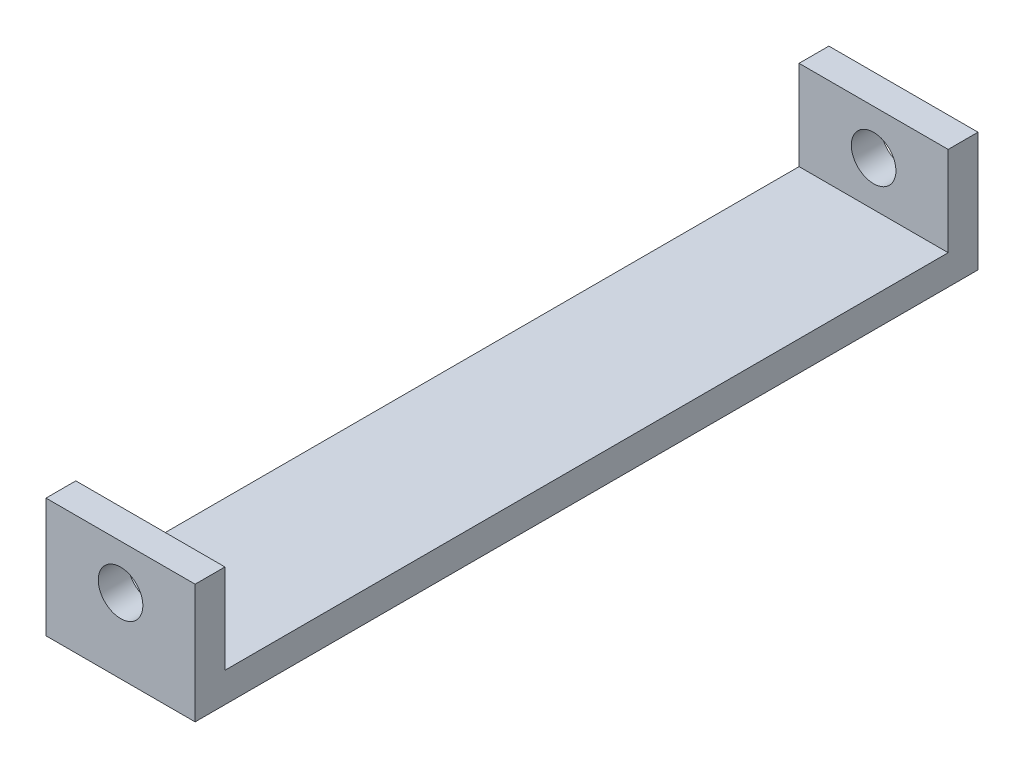
ISO-10303-21;
HEADER;
FILE_DESCRIPTION(('STEP AP214'),'2;1');
FILE_NAME('part.step','',(''),(''),'','','');
FILE_SCHEMA(('AUTOMOTIVE_DESIGN { 1 0 10303 214 1 1 1 1 }'));
ENDSEC;
DATA;
#1=APPLICATION_CONTEXT('core data for automotive mechanical design processes');
#2=APPLICATION_PROTOCOL_DEFINITION('international standard','automotive_design',2000,#1);
#3=PRODUCT_CONTEXT('',#1,'mechanical');
#4=PRODUCT('Part','Part','',(#3));
#5=PRODUCT_RELATED_PRODUCT_CATEGORY('part','',(#4));
#6=PRODUCT_DEFINITION_FORMATION('','',#4);
#7=PRODUCT_DEFINITION_CONTEXT('part definition',#1,'design');
#8=PRODUCT_DEFINITION('design','',#6,#7);
#9=PRODUCT_DEFINITION_SHAPE('','',#8);
#10=(LENGTH_UNIT() NAMED_UNIT(*) SI_UNIT(.MILLI.,.METRE.));
#11=(NAMED_UNIT(*) PLANE_ANGLE_UNIT() SI_UNIT($,.RADIAN.));
#12=(NAMED_UNIT(*) SI_UNIT($,.STERADIAN.) SOLID_ANGLE_UNIT());
#13=UNCERTAINTY_MEASURE_WITH_UNIT(LENGTH_MEASURE(1.E-05),#10,'distance_accuracy_value','');
#14=(GEOMETRIC_REPRESENTATION_CONTEXT(3) GLOBAL_UNCERTAINTY_ASSIGNED_CONTEXT((#13)) GLOBAL_UNIT_ASSIGNED_CONTEXT((#10,
#11,#12)) REPRESENTATION_CONTEXT('',''));
#15=CARTESIAN_POINT('',(0.,0.,0.));
#16=DIRECTION('',(0.,0.,1.));
#17=DIRECTION('',(1.,0.,0.));
#18=AXIS2_PLACEMENT_3D('',#15,#16,#17);
#19=CARTESIAN_POINT('',(12.7,8.128,1.27));
#20=DIRECTION('',(0.,0.,1.));
#21=DIRECTION('',(1.,0.,0.));
#22=AXIS2_PLACEMENT_3D('',#19,#20,#21);
#23=PLANE('',#22);
#24=CARTESIAN_POINT('',(6.35,11.938,1.27));
#25=DIRECTION('',(0.,0.,-1.));
#26=DIRECTION('',(-1.,0.,0.));
#27=AXIS2_PLACEMENT_3D('',#24,#25,#26);
#28=CIRCLE('',#27,1.89864999999999);
#29=CARTESIAN_POINT('',(4.45135000000001,11.938,1.27));
#30=VERTEX_POINT('',#29);
#31=EDGE_CURVE('E180',#30,#30,#28,.T.);
#32=ORIENTED_EDGE('',*,*,#31,.F.);
#33=EDGE_LOOP('',(#32));
#34=FACE_BOUND('',#33,.T.);
#35=DIRECTION('',(0.,1.,0.));
#36=VECTOR('',#35,1.);
#37=CARTESIAN_POINT('',(0.,8.128,1.27));
#38=LINE('',#37,#36);
#39=CARTESIAN_POINT('',(0.,8.128,1.27));
#40=VERTEX_POINT('',#39);
#41=CARTESIAN_POINT('',(0.,15.748,1.27));
#42=VERTEX_POINT('',#41);
#43=EDGE_CURVE('E130',#40,#42,#38,.T.);
#44=ORIENTED_EDGE('',*,*,#43,.T.);
#45=DIRECTION('',(-1.,0.,0.));
#46=VECTOR('',#45,1.);
#47=CARTESIAN_POINT('',(12.7,15.748,1.27));
#48=LINE('',#47,#46);
#49=CARTESIAN_POINT('',(12.7,15.748,1.27));
#50=VERTEX_POINT('',#49);
#51=EDGE_CURVE('E11',#50,#42,#48,.T.);
#52=ORIENTED_EDGE('',*,*,#51,.F.);
#53=DIRECTION('',(0.,1.,0.));
#54=VECTOR('',#53,1.);
#55=CARTESIAN_POINT('',(12.7,8.128,1.27));
#56=LINE('',#55,#54);
#57=CARTESIAN_POINT('',(12.7,8.128,1.27));
#58=VERTEX_POINT('',#57);
#59=EDGE_CURVE('E88',#58,#50,#56,.T.);
#60=ORIENTED_EDGE('',*,*,#59,.F.);
#61=DIRECTION('',(-1.,0.,0.));
#62=VECTOR('',#61,1.);
#63=CARTESIAN_POINT('',(12.7,8.128,1.27));
#64=LINE('',#63,#62);
#65=EDGE_CURVE('E129',#58,#40,#64,.T.);
#66=ORIENTED_EDGE('',*,*,#65,.T.);
#67=EDGE_LOOP('',(#44,#52,#60,#66));
#68=FACE_BOUND('',#67,.T.);
#69=ADVANCED_FACE('F33',(#34,#68),#23,.F.);
#70=CARTESIAN_POINT('',(12.7,15.748,3.81));
#71=DIRECTION('',(0.,1.,0.));
#72=DIRECTION('',(0.,0.,1.));
#73=AXIS2_PLACEMENT_3D('',#70,#71,#72);
#74=PLANE('',#73);
#75=DIRECTION('',(0.,0.,-1.));
#76=VECTOR('',#75,1.);
#77=CARTESIAN_POINT('',(0.,15.748,3.81));
#78=LINE('',#77,#76);
#79=CARTESIAN_POINT('',(0.,15.748,3.81));
#80=VERTEX_POINT('',#79);
#81=EDGE_CURVE('E133',#80,#42,#78,.T.);
#82=ORIENTED_EDGE('',*,*,#81,.F.);
#83=DIRECTION('',(-1.,0.,0.));
#84=VECTOR('',#83,1.);
#85=CARTESIAN_POINT('',(12.7,15.748,3.81));
#86=LINE('',#85,#84);
#87=CARTESIAN_POINT('',(12.7,15.748,3.81));
#88=VERTEX_POINT('',#87);
#89=EDGE_CURVE('E41',#88,#80,#86,.T.);
#90=ORIENTED_EDGE('',*,*,#89,.F.);
#91=DIRECTION('',(0.,0.,-1.));
#92=VECTOR('',#91,1.);
#93=CARTESIAN_POINT('',(12.7,15.748,3.81));
#94=LINE('',#93,#92);
#95=EDGE_CURVE('E173',#88,#50,#94,.T.);
#96=ORIENTED_EDGE('',*,*,#95,.T.);
#97=ORIENTED_EDGE('',*,*,#51,.T.);
#98=EDGE_LOOP('',(#82,#90,#96,#97));
#99=FACE_BOUND('',#98,.T.);
#100=ADVANCED_FACE('F164',(#99),#74,.T.);
#101=CARTESIAN_POINT('',(12.7,8.128,3.81));
#102=DIRECTION('',(0.,0.,1.));
#103=DIRECTION('',(1.,0.,0.));
#104=AXIS2_PLACEMENT_3D('',#101,#102,#103);
#105=PLANE('',#104);
#106=CARTESIAN_POINT('',(6.35,11.938,3.81));
#107=DIRECTION('',(0.,0.,1.));
#108=DIRECTION('',(1.,0.,0.));
#109=AXIS2_PLACEMENT_3D('',#106,#107,#108);
#110=CIRCLE('',#109,1.89864999999999);
#111=CARTESIAN_POINT('',(8.24864999999999,11.938,3.81));
#112=VERTEX_POINT('',#111);
#113=EDGE_CURVE('E134',#112,#112,#110,.T.);
#114=ORIENTED_EDGE('',*,*,#113,.F.);
#115=EDGE_LOOP('',(#114));
#116=FACE_BOUND('',#115,.T.);
#117=DIRECTION('',(0.,1.,0.));
#118=VECTOR('',#117,1.);
#119=CARTESIAN_POINT('',(0.,8.128,3.81));
#120=LINE('',#119,#118);
#121=CARTESIAN_POINT('',(0.,5.588,3.81));
#122=VERTEX_POINT('',#121);
#123=EDGE_CURVE('E137',#122,#80,#120,.T.);
#124=ORIENTED_EDGE('',*,*,#123,.F.);
#125=DIRECTION('',(-1.,0.,0.));
#126=VECTOR('',#125,1.);
#127=CARTESIAN_POINT('',(12.7,5.588,3.81));
#128=LINE('',#127,#126);
#129=CARTESIAN_POINT('',(12.7,5.588,3.81));
#130=VERTEX_POINT('',#129);
#131=EDGE_CURVE('E154',#130,#122,#128,.T.);
#132=ORIENTED_EDGE('',*,*,#131,.F.);
#133=DIRECTION('',(0.,1.,0.));
#134=VECTOR('',#133,1.);
#135=CARTESIAN_POINT('',(12.7,8.128,3.81));
#136=LINE('',#135,#134);
#137=EDGE_CURVE('E161',#130,#88,#136,.T.);
#138=ORIENTED_EDGE('',*,*,#137,.T.);
#139=ORIENTED_EDGE('',*,*,#89,.T.);
#140=EDGE_LOOP('',(#124,#132,#138,#139));
#141=FACE_BOUND('',#140,.T.);
#142=ADVANCED_FACE('F159',(#116,#141),#105,.T.);
#143=CARTESIAN_POINT('',(12.7,5.588,1.27));
#144=DIRECTION('',(0.,-1.,0.));
#145=DIRECTION('',(0.,0.,-1.));
#146=AXIS2_PLACEMENT_3D('',#143,#144,#145);
#147=PLANE('',#146);
#148=DIRECTION('',(0.,0.,-1.));
#149=VECTOR('',#148,1.);
#150=CARTESIAN_POINT('',(0.,5.588,1.27));
#151=LINE('',#150,#149);
#152=CARTESIAN_POINT('',(0.,5.588,-62.865));
#153=VERTEX_POINT('',#152);
#154=EDGE_CURVE('E140',#153,#122,#151,.F.);
#155=ORIENTED_EDGE('',*,*,#154,.F.);
#156=DIRECTION('',(-1.,0.,0.));
#157=VECTOR('',#156,1.);
#158=CARTESIAN_POINT('',(12.7,5.588,-62.865));
#159=LINE('',#158,#157);
#160=CARTESIAN_POINT('',(12.7,5.588,-62.865));
#161=VERTEX_POINT('',#160);
#162=EDGE_CURVE('E152',#161,#153,#159,.T.);
#163=ORIENTED_EDGE('',*,*,#162,.F.);
#164=DIRECTION('',(0.,0.,-1.));
#165=VECTOR('',#164,1.);
#166=CARTESIAN_POINT('',(12.7,5.588,1.27));
#167=LINE('',#166,#165);
#168=EDGE_CURVE('E124',#161,#130,#167,.F.);
#169=ORIENTED_EDGE('',*,*,#168,.T.);
#170=ORIENTED_EDGE('',*,*,#131,.T.);
#171=EDGE_LOOP('',(#155,#163,#169,#170));
#172=FACE_BOUND('',#171,.T.);
#173=ADVANCED_FACE('F171',(#172),#147,.T.);
#174=CARTESIAN_POINT('',(12.7,8.128,-62.865));
#175=DIRECTION('',(0.,0.,-1.));
#176=DIRECTION('',(-1.,0.,0.));
#177=AXIS2_PLACEMENT_3D('',#174,#175,#176);
#178=PLANE('',#177);
#179=CARTESIAN_POINT('',(6.35,11.938,-62.865));
#180=DIRECTION('',(0.,0.,-1.));
#181=DIRECTION('',(-1.,0.,0.));
#182=AXIS2_PLACEMENT_3D('',#179,#180,#181);
#183=CIRCLE('',#182,1.89864999999999);
#184=CARTESIAN_POINT('',(4.45135000000001,11.938,-62.865));
#185=VERTEX_POINT('',#184);
#186=EDGE_CURVE('E183',#185,#185,#183,.T.);
#187=ORIENTED_EDGE('',*,*,#186,.F.);
#188=EDGE_LOOP('',(#187));
#189=FACE_BOUND('',#188,.T.);
#190=DIRECTION('',(0.,1.,0.));
#191=VECTOR('',#190,1.);
#192=CARTESIAN_POINT('',(0.,8.128,-62.865));
#193=LINE('',#192,#191);
#194=CARTESIAN_POINT('',(0.,15.748,-62.865));
#195=VERTEX_POINT('',#194);
#196=EDGE_CURVE('E143',#195,#153,#193,.F.);
#197=ORIENTED_EDGE('',*,*,#196,.F.);
#198=DIRECTION('',(-1.,0.,0.));
#199=VECTOR('',#198,1.);
#200=CARTESIAN_POINT('',(12.7,15.748,-62.865));
#201=LINE('',#200,#199);
#202=CARTESIAN_POINT('',(12.7,15.748,-62.865));
#203=VERTEX_POINT('',#202);
#204=EDGE_CURVE('E112',#203,#195,#201,.T.);
#205=ORIENTED_EDGE('',*,*,#204,.F.);
#206=DIRECTION('',(0.,1.,0.));
#207=VECTOR('',#206,1.);
#208=CARTESIAN_POINT('',(12.7,8.128,-62.865));
#209=LINE('',#208,#207);
#210=EDGE_CURVE('E122',#203,#161,#209,.F.);
#211=ORIENTED_EDGE('',*,*,#210,.T.);
#212=ORIENTED_EDGE('',*,*,#162,.T.);
#213=EDGE_LOOP('',(#197,#205,#211,#212));
#214=FACE_BOUND('',#213,.T.);
#215=ADVANCED_FACE('F200',(#189,#214),#178,.T.);
#216=CARTESIAN_POINT('',(12.7,15.748,-60.325));
#217=DIRECTION('',(0.,1.,0.));
#218=DIRECTION('',(0.,0.,1.));
#219=AXIS2_PLACEMENT_3D('',#216,#217,#218);
#220=PLANE('',#219);
#221=DIRECTION('',(0.,0.,-1.));
#222=VECTOR('',#221,1.);
#223=CARTESIAN_POINT('',(0.,15.748,-60.325));
#224=LINE('',#223,#222);
#225=CARTESIAN_POINT('',(0.,15.748,-60.325));
#226=VERTEX_POINT('',#225);
#227=EDGE_CURVE('E111',#226,#195,#224,.T.);
#228=ORIENTED_EDGE('',*,*,#227,.F.);
#229=DIRECTION('',(-1.,0.,0.));
#230=VECTOR('',#229,1.);
#231=CARTESIAN_POINT('',(12.7,15.748,-60.325));
#232=LINE('',#231,#230);
#233=CARTESIAN_POINT('',(12.7,15.748,-60.325));
#234=VERTEX_POINT('',#233);
#235=EDGE_CURVE('E105',#234,#226,#232,.T.);
#236=ORIENTED_EDGE('',*,*,#235,.F.);
#237=DIRECTION('',(0.,0.,-1.));
#238=VECTOR('',#237,1.);
#239=CARTESIAN_POINT('',(12.7,15.748,-60.325));
#240=LINE('',#239,#238);
#241=EDGE_CURVE('E109',#234,#203,#240,.T.);
#242=ORIENTED_EDGE('',*,*,#241,.T.);
#243=ORIENTED_EDGE('',*,*,#204,.T.);
#244=EDGE_LOOP('',(#228,#236,#242,#243));
#245=FACE_BOUND('',#244,.T.);
#246=ADVANCED_FACE('F107',(#245),#220,.T.);
#247=CARTESIAN_POINT('',(12.7,8.128,-60.325));
#248=DIRECTION('',(0.,0.,-1.));
#249=DIRECTION('',(-1.,0.,0.));
#250=AXIS2_PLACEMENT_3D('',#247,#248,#249);
#251=PLANE('',#250);
#252=CARTESIAN_POINT('',(6.35,11.938,-60.325));
#253=DIRECTION('',(0.,0.,1.));
#254=DIRECTION('',(1.,0.,0.));
#255=AXIS2_PLACEMENT_3D('',#252,#253,#254);
#256=CIRCLE('',#255,1.89864999999999);
#257=CARTESIAN_POINT('',(8.24864999999999,11.938,-60.325));
#258=VERTEX_POINT('',#257);
#259=EDGE_CURVE('E186',#258,#258,#256,.T.);
#260=ORIENTED_EDGE('',*,*,#259,.F.);
#261=EDGE_LOOP('',(#260));
#262=FACE_BOUND('',#261,.T.);
#263=DIRECTION('',(0.,-1.,0.));
#264=VECTOR('',#263,1.);
#265=CARTESIAN_POINT('',(0.,8.128,-60.325));
#266=LINE('',#265,#264);
#267=CARTESIAN_POINT('',(0.,8.128,-60.325));
#268=VERTEX_POINT('',#267);
#269=EDGE_CURVE('E76',#226,#268,#266,.T.);
#270=ORIENTED_EDGE('',*,*,#269,.T.);
#271=DIRECTION('',(-1.,0.,0.));
#272=VECTOR('',#271,1.);
#273=CARTESIAN_POINT('',(12.7,8.128,-60.325));
#274=LINE('',#273,#272);
#275=CARTESIAN_POINT('',(12.7,8.128,-60.325));
#276=VERTEX_POINT('',#275);
#277=EDGE_CURVE('E113',#276,#268,#274,.T.);
#278=ORIENTED_EDGE('',*,*,#277,.F.);
#279=DIRECTION('',(0.,-1.,0.));
#280=VECTOR('',#279,1.);
#281=CARTESIAN_POINT('',(12.7,8.128,-60.325));
#282=LINE('',#281,#280);
#283=EDGE_CURVE('E115',#234,#276,#282,.T.);
#284=ORIENTED_EDGE('',*,*,#283,.F.);
#285=ORIENTED_EDGE('',*,*,#235,.T.);
#286=EDGE_LOOP('',(#270,#278,#284,#285));
#287=FACE_BOUND('',#286,.T.);
#288=ADVANCED_FACE('F116',(#262,#287),#251,.F.);
#289=CARTESIAN_POINT('',(12.7,8.128,1.27));
#290=DIRECTION('',(0.,-1.,0.));
#291=DIRECTION('',(0.,0.,-1.));
#292=AXIS2_PLACEMENT_3D('',#289,#290,#291);
#293=PLANE('',#292);
#294=DIRECTION('',(0.,0.,1.));
#295=VECTOR('',#294,1.);
#296=CARTESIAN_POINT('',(0.,8.128,1.27));
#297=LINE('',#296,#295);
#298=EDGE_CURVE('E82',#268,#40,#297,.T.);
#299=ORIENTED_EDGE('',*,*,#298,.T.);
#300=ORIENTED_EDGE('',*,*,#65,.F.);
#301=DIRECTION('',(0.,0.,1.));
#302=VECTOR('',#301,1.);
#303=CARTESIAN_POINT('',(12.7,8.128,1.27));
#304=LINE('',#303,#302);
#305=EDGE_CURVE('E49',#276,#58,#304,.T.);
#306=ORIENTED_EDGE('',*,*,#305,.F.);
#307=ORIENTED_EDGE('',*,*,#277,.T.);
#308=EDGE_LOOP('',(#299,#300,#306,#307));
#309=FACE_BOUND('',#308,.T.);
#310=ADVANCED_FACE('F193',(#309),#293,.F.);
#311=CARTESIAN_POINT('',(12.7,0.,0.));
#312=DIRECTION('',(-1.,0.,0.));
#313=DIRECTION('',(0.,0.,1.));
#314=AXIS2_PLACEMENT_3D('',#311,#312,#313);
#315=PLANE('',#314);
#316=ORIENTED_EDGE('',*,*,#59,.T.);
#317=ORIENTED_EDGE('',*,*,#95,.F.);
#318=ORIENTED_EDGE('',*,*,#137,.F.);
#319=ORIENTED_EDGE('',*,*,#168,.F.);
#320=ORIENTED_EDGE('',*,*,#210,.F.);
#321=ORIENTED_EDGE('',*,*,#241,.F.);
#322=ORIENTED_EDGE('',*,*,#283,.T.);
#323=ORIENTED_EDGE('',*,*,#305,.T.);
#324=EDGE_LOOP('',(#316,#317,#318,#319,#320,#321,#322,#323));
#325=FACE_BOUND('',#324,.T.);
#326=ADVANCED_FACE('F119',(#325),#315,.F.);
#327=CARTESIAN_POINT('',(0.,0.,0.));
#328=DIRECTION('',(-1.,0.,0.));
#329=DIRECTION('',(0.,0.,1.));
#330=AXIS2_PLACEMENT_3D('',#327,#328,#329);
#331=PLANE('',#330);
#332=ORIENTED_EDGE('',*,*,#43,.F.);
#333=ORIENTED_EDGE('',*,*,#298,.F.);
#334=ORIENTED_EDGE('',*,*,#269,.F.);
#335=ORIENTED_EDGE('',*,*,#227,.T.);
#336=ORIENTED_EDGE('',*,*,#196,.T.);
#337=ORIENTED_EDGE('',*,*,#154,.T.);
#338=ORIENTED_EDGE('',*,*,#123,.T.);
#339=ORIENTED_EDGE('',*,*,#81,.T.);
#340=EDGE_LOOP('',(#332,#333,#334,#335,#336,#337,#338,#339));
#341=FACE_BOUND('',#340,.T.);
#342=ADVANCED_FACE('F167',(#341),#331,.T.);
#343=CARTESIAN_POINT('',(6.35,11.938,1.27));
#344=DIRECTION('',(0.,0.,-1.));
#345=DIRECTION('',(-1.,0.,0.));
#346=AXIS2_PLACEMENT_3D('',#343,#344,#345);
#347=CYLINDRICAL_SURFACE('',#346,1.89864999999999);
#348=ORIENTED_EDGE('',*,*,#113,.T.);
#349=EDGE_LOOP('',(#348));
#350=FACE_BOUND('',#349,.T.);
#351=ORIENTED_EDGE('',*,*,#31,.T.);
#352=EDGE_LOOP('',(#351));
#353=FACE_BOUND('',#352,.T.);
#354=ADVANCED_FACE('F210',(#350,#353),#347,.F.);
#355=CARTESIAN_POINT('',(6.35,11.938,-60.325));
#356=DIRECTION('',(0.,0.,1.));
#357=DIRECTION('',(1.,0.,0.));
#358=AXIS2_PLACEMENT_3D('',#355,#356,#357);
#359=CYLINDRICAL_SURFACE('',#358,1.89864999999999);
#360=ORIENTED_EDGE('',*,*,#186,.T.);
#361=EDGE_LOOP('',(#360));
#362=FACE_BOUND('',#361,.T.);
#363=ORIENTED_EDGE('',*,*,#259,.T.);
#364=EDGE_LOOP('',(#363));
#365=FACE_BOUND('',#364,.T.);
#366=ADVANCED_FACE('F190',(#362,#365),#359,.F.);
#367=CLOSED_SHELL('',(#69,#100,#142,#173,#215,#246,#288,#310,#326,#342,#354,#366));
#368=MANIFOLD_SOLID_BREP('B2',#367);
#369=ADVANCED_BREP_SHAPE_REPRESENTATION('',(#18,#368),#14);
#370=SHAPE_DEFINITION_REPRESENTATION(#9,#369);
ENDSEC;
END-ISO-10303-21;
